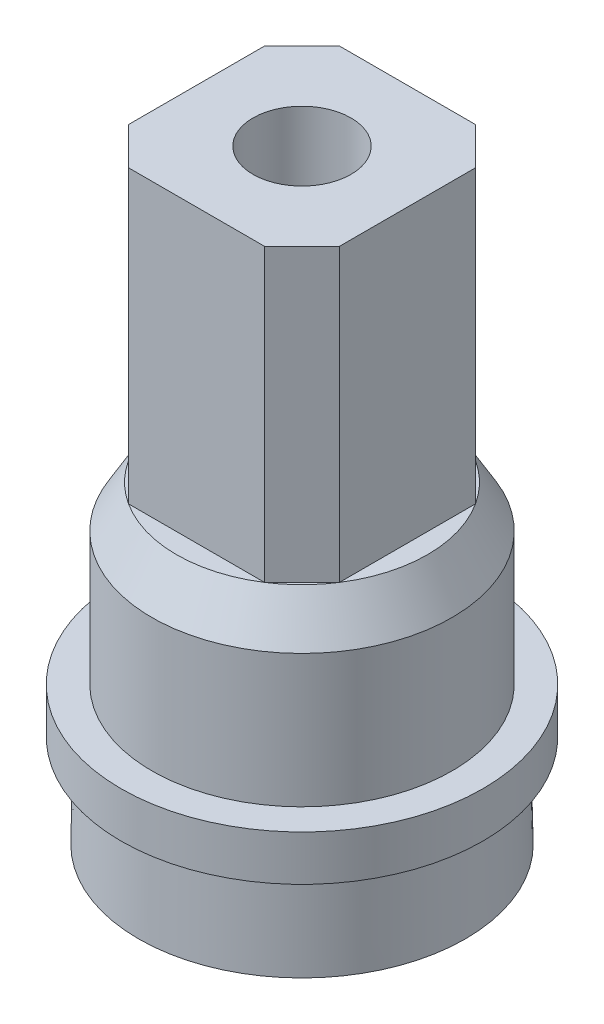
ISO-10303-21;
HEADER;
FILE_DESCRIPTION(('STEP AP214'),'2;1');
FILE_NAME('part.step','',(''),(''),'','','');
FILE_SCHEMA(('AUTOMOTIVE_DESIGN { 1 0 10303 214 1 1 1 1 }'));
ENDSEC;
DATA;
#1=APPLICATION_CONTEXT('core data for automotive mechanical design processes');
#2=APPLICATION_PROTOCOL_DEFINITION('international standard','automotive_design',2000,#1);
#3=PRODUCT_CONTEXT('',#1,'mechanical');
#4=PRODUCT('Part','Part','',(#3));
#5=PRODUCT_RELATED_PRODUCT_CATEGORY('part','',(#4));
#6=PRODUCT_DEFINITION_FORMATION('','',#4);
#7=PRODUCT_DEFINITION_CONTEXT('part definition',#1,'design');
#8=PRODUCT_DEFINITION('design','',#6,#7);
#9=PRODUCT_DEFINITION_SHAPE('','',#8);
#10=(LENGTH_UNIT() NAMED_UNIT(*) SI_UNIT(.MILLI.,.METRE.));
#11=(NAMED_UNIT(*) PLANE_ANGLE_UNIT() SI_UNIT($,.RADIAN.));
#12=(NAMED_UNIT(*) SI_UNIT($,.STERADIAN.) SOLID_ANGLE_UNIT());
#13=UNCERTAINTY_MEASURE_WITH_UNIT(LENGTH_MEASURE(1.E-05),#10,'distance_accuracy_value','');
#14=(GEOMETRIC_REPRESENTATION_CONTEXT(3) GLOBAL_UNCERTAINTY_ASSIGNED_CONTEXT((#13)) GLOBAL_UNIT_ASSIGNED_CONTEXT((#10,
#11,#12)) REPRESENTATION_CONTEXT('',''));
#15=CARTESIAN_POINT('',(0.,0.,0.));
#16=DIRECTION('',(0.,0.,1.));
#17=DIRECTION('',(1.,0.,0.));
#18=AXIS2_PLACEMENT_3D('',#15,#16,#17);
#19=CARTESIAN_POINT('',(-1.295,8.3,0.));
#20=DIRECTION('',(0.,-1.,0.));
#21=DIRECTION('',(0.,0.,-1.));
#22=AXIS2_PLACEMENT_3D('',#19,#20,#21);
#23=PLANE('',#22);
#24=DIRECTION('',(-0.707106781186548,0.,-0.707106781186548));
#25=VECTOR('',#24,1.);
#26=CARTESIAN_POINT('',(2.79,8.3,-1.79952771581879));
#27=LINE('',#26,#25);
#28=CARTESIAN_POINT('',(2.79,8.3,-1.79952771581879));
#29=VERTEX_POINT('',#28);
#30=CARTESIAN_POINT('',(1.79952771581879,8.3,-2.79));
#31=VERTEX_POINT('',#30);
#32=EDGE_CURVE('E149',#29,#31,#27,.T.);
#33=ORIENTED_EDGE('',*,*,#32,.F.);
#34=CARTESIAN_POINT('',(0.,8.3,0.));
#35=DIRECTION('',(0.,-1.,0.));
#36=DIRECTION('',(0.,0.,-1.));
#37=AXIS2_PLACEMENT_3D('',#34,#35,#36);
#38=CIRCLE('',#37,3.32);
#39=EDGE_CURVE('E183',#31,#29,#38,.T.);
#40=ORIENTED_EDGE('',*,*,#39,.F.);
#41=EDGE_LOOP('',(#33,#40));
#42=FACE_BOUND('',#41,.T.);
#43=ADVANCED_FACE('F40',(#42),#23,.F.);
#44=DIRECTION('',(0.,0.,-1.));
#45=VECTOR('',#44,1.);
#46=CARTESIAN_POINT('',(2.79,8.3,1.79952771581879));
#47=LINE('',#46,#45);
#48=CARTESIAN_POINT('',(2.79,8.3,1.79952771581879));
#49=VERTEX_POINT('',#48);
#50=EDGE_CURVE('E146',#49,#29,#47,.T.);
#51=ORIENTED_EDGE('',*,*,#50,.F.);
#52=EDGE_CURVE('E188',#29,#49,#38,.T.);
#53=ORIENTED_EDGE('',*,*,#52,.F.);
#54=EDGE_LOOP('',(#51,#53));
#55=FACE_BOUND('',#54,.T.);
#56=ADVANCED_FACE('F362',(#55),#23,.F.);
#57=DIRECTION('',(0.707106781186548,0.,-0.707106781186548));
#58=VECTOR('',#57,1.);
#59=CARTESIAN_POINT('',(1.79952771581879,8.3,2.79));
#60=LINE('',#59,#58);
#61=CARTESIAN_POINT('',(1.79952771581879,8.3,2.79));
#62=VERTEX_POINT('',#61);
#63=EDGE_CURVE('E260',#62,#49,#60,.T.);
#64=ORIENTED_EDGE('',*,*,#63,.F.);
#65=EDGE_CURVE('E318',#49,#62,#38,.T.);
#66=ORIENTED_EDGE('',*,*,#65,.F.);
#67=EDGE_LOOP('',(#64,#66));
#68=FACE_BOUND('',#67,.T.);
#69=ADVANCED_FACE('F317',(#68),#23,.F.);
#70=DIRECTION('',(1.,0.,0.));
#71=VECTOR('',#70,1.);
#72=CARTESIAN_POINT('',(-1.79952771581879,8.3,2.79));
#73=LINE('',#72,#71);
#74=CARTESIAN_POINT('',(-1.79952771581879,8.3,2.79));
#75=VERTEX_POINT('',#74);
#76=EDGE_CURVE('E308',#75,#62,#73,.T.);
#77=ORIENTED_EDGE('',*,*,#76,.F.);
#78=EDGE_CURVE('E321',#62,#75,#38,.T.);
#79=ORIENTED_EDGE('',*,*,#78,.F.);
#80=EDGE_LOOP('',(#77,#79));
#81=FACE_BOUND('',#80,.T.);
#82=ADVANCED_FACE('F322',(#81),#23,.F.);
#83=DIRECTION('',(0.707106781186548,0.,0.707106781186548));
#84=VECTOR('',#83,1.);
#85=CARTESIAN_POINT('',(-2.79,8.3,1.79952771581879));
#86=LINE('',#85,#84);
#87=CARTESIAN_POINT('',(-2.79,8.3,1.79952771581879));
#88=VERTEX_POINT('',#87);
#89=EDGE_CURVE('E66',#88,#75,#86,.T.);
#90=ORIENTED_EDGE('',*,*,#89,.F.);
#91=EDGE_CURVE('E325',#75,#88,#38,.T.);
#92=ORIENTED_EDGE('',*,*,#91,.F.);
#93=EDGE_LOOP('',(#90,#92));
#94=FACE_BOUND('',#93,.T.);
#95=ADVANCED_FACE('F381',(#94),#23,.F.);
#96=DIRECTION('',(0.,0.,1.));
#97=VECTOR('',#96,1.);
#98=CARTESIAN_POINT('',(-2.79,8.3,-1.79952771581879));
#99=LINE('',#98,#97);
#100=CARTESIAN_POINT('',(-2.79,8.3,-1.79952771581879));
#101=VERTEX_POINT('',#100);
#102=EDGE_CURVE('E58',#101,#88,#99,.T.);
#103=ORIENTED_EDGE('',*,*,#102,.F.);
#104=EDGE_CURVE('E377',#88,#101,#38,.T.);
#105=ORIENTED_EDGE('',*,*,#104,.F.);
#106=EDGE_LOOP('',(#103,#105));
#107=FACE_BOUND('',#106,.T.);
#108=ADVANCED_FACE('F374',(#107),#23,.F.);
#109=DIRECTION('',(-0.707106781186548,0.,0.707106781186548));
#110=VECTOR('',#109,1.);
#111=CARTESIAN_POINT('',(-1.79952771581879,8.3,-2.79));
#112=LINE('',#111,#110);
#113=CARTESIAN_POINT('',(-1.79952771581879,8.3,-2.79));
#114=VERTEX_POINT('',#113);
#115=EDGE_CURVE('E295',#114,#101,#112,.T.);
#116=ORIENTED_EDGE('',*,*,#115,.F.);
#117=EDGE_CURVE('E376',#101,#114,#38,.T.);
#118=ORIENTED_EDGE('',*,*,#117,.F.);
#119=EDGE_LOOP('',(#116,#118));
#120=FACE_BOUND('',#119,.T.);
#121=ADVANCED_FACE('F369',(#120),#23,.F.);
#122=DIRECTION('',(-1.,0.,0.));
#123=VECTOR('',#122,1.);
#124=CARTESIAN_POINT('',(1.79952771581879,8.3,-2.79));
#125=LINE('',#124,#123);
#126=EDGE_CURVE('E298',#31,#114,#125,.T.);
#127=ORIENTED_EDGE('',*,*,#126,.F.);
#128=EDGE_CURVE('E182',#114,#31,#38,.T.);
#129=ORIENTED_EDGE('',*,*,#128,.F.);
#130=EDGE_LOOP('',(#127,#129));
#131=FACE_BOUND('',#130,.T.);
#132=ADVANCED_FACE('F204',(#131),#23,.F.);
#133=CARTESIAN_POINT('',(-4.325,0.,0.));
#134=DIRECTION('',(0.,1.,0.));
#135=DIRECTION('',(0.,0.,1.));
#136=AXIS2_PLACEMENT_3D('',#133,#134,#135);
#137=PLANE('',#136);
#138=CARTESIAN_POINT('',(0.,0.,0.));
#139=DIRECTION('',(0.,-1.,0.));
#140=DIRECTION('',(0.,0.,-1.));
#141=AXIS2_PLACEMENT_3D('',#138,#139,#140);
#142=CIRCLE('',#141,2.7);
#143=CARTESIAN_POINT('',(0.,0.,-2.7));
#144=VERTEX_POINT('',#143);
#145=EDGE_CURVE('E11',#144,#144,#142,.T.);
#146=ORIENTED_EDGE('',*,*,#145,.F.);
#147=EDGE_LOOP('',(#146));
#148=FACE_BOUND('',#147,.T.);
#149=CARTESIAN_POINT('',(0.,0.,0.));
#150=DIRECTION('',(0.,-1.,0.));
#151=DIRECTION('',(0.,0.,-1.));
#152=AXIS2_PLACEMENT_3D('',#149,#150,#151);
#153=CIRCLE('',#152,4.325);
#154=CARTESIAN_POINT('',(0.,0.,-4.325));
#155=VERTEX_POINT('',#154);
#156=EDGE_CURVE('E151',#155,#155,#153,.T.);
#157=ORIENTED_EDGE('',*,*,#156,.T.);
#158=EDGE_LOOP('',(#157));
#159=FACE_BOUND('',#158,.T.);
#160=ADVANCED_FACE('F42',(#148,#159),#137,.F.);
#161=CARTESIAN_POINT('',(0.,0.,0.));
#162=DIRECTION('',(0.,-1.,0.));
#163=DIRECTION('',(0.,0.,-1.));
#164=AXIS2_PLACEMENT_3D('',#161,#162,#163);
#165=CYLINDRICAL_SURFACE('',#164,2.7);
#166=CARTESIAN_POINT('',(0.,5.54,0.));
#167=DIRECTION('',(0.,-1.,0.));
#168=DIRECTION('',(0.,0.,-1.));
#169=AXIS2_PLACEMENT_3D('',#166,#167,#168);
#170=CIRCLE('',#169,2.7);
#171=CARTESIAN_POINT('',(0.,5.54,-2.7));
#172=VERTEX_POINT('',#171);
#173=EDGE_CURVE('E49',#172,#172,#170,.T.);
#174=ORIENTED_EDGE('',*,*,#173,.F.);
#175=EDGE_LOOP('',(#174));
#176=FACE_BOUND('',#175,.T.);
#177=ORIENTED_EDGE('',*,*,#145,.T.);
#178=EDGE_LOOP('',(#177));
#179=FACE_BOUND('',#178,.T.);
#180=ADVANCED_FACE('F197',(#176,#179),#165,.F.);
#181=CARTESIAN_POINT('',(-2.7,5.54,0.));
#182=DIRECTION('',(0.,1.,0.));
#183=DIRECTION('',(0.,0.,1.));
#184=AXIS2_PLACEMENT_3D('',#181,#182,#183);
#185=PLANE('',#184);
#186=CARTESIAN_POINT('',(0.,5.54,0.));
#187=DIRECTION('',(0.,-1.,0.));
#188=DIRECTION('',(0.,0.,-1.));
#189=AXIS2_PLACEMENT_3D('',#186,#187,#188);
#190=CIRCLE('',#189,1.295);
#191=CARTESIAN_POINT('',(0.,5.54,-1.295));
#192=VERTEX_POINT('',#191);
#193=EDGE_CURVE('E187',#192,#192,#190,.T.);
#194=ORIENTED_EDGE('',*,*,#193,.F.);
#195=EDGE_LOOP('',(#194));
#196=FACE_BOUND('',#195,.T.);
#197=ORIENTED_EDGE('',*,*,#173,.T.);
#198=EDGE_LOOP('',(#197));
#199=FACE_BOUND('',#198,.T.);
#200=ADVANCED_FACE('F195',(#196,#199),#185,.F.);
#201=CARTESIAN_POINT('',(0.,0.,0.));
#202=DIRECTION('',(0.,-1.,0.));
#203=DIRECTION('',(0.,0.,-1.));
#204=AXIS2_PLACEMENT_3D('',#201,#202,#203);
#205=CYLINDRICAL_SURFACE('',#204,1.295);
#206=ORIENTED_EDGE('',*,*,#193,.T.);
#207=EDGE_LOOP('',(#206));
#208=FACE_BOUND('',#207,.T.);
#209=CARTESIAN_POINT('',(0.,16.,0.));
#210=DIRECTION('',(0.,1.,0.));
#211=DIRECTION('',(0.,0.,1.));
#212=AXIS2_PLACEMENT_3D('',#209,#210,#211);
#213=CIRCLE('',#212,1.295);
#214=CARTESIAN_POINT('',(0.,16.,1.295));
#215=VERTEX_POINT('',#214);
#216=EDGE_CURVE('E346',#215,#215,#213,.T.);
#217=ORIENTED_EDGE('',*,*,#216,.T.);
#218=EDGE_LOOP('',(#217));
#219=FACE_BOUND('',#218,.T.);
#220=ADVANCED_FACE('F240',(#208,#219),#205,.F.);
#221=CARTESIAN_POINT('',(0.,8.3,0.));
#222=DIRECTION('',(0.,-1.,0.));
#223=DIRECTION('',(0.,0.,-1.));
#224=AXIS2_PLACEMENT_3D('',#221,#222,#223);
#225=CONICAL_SURFACE('',#224,3.32,0.527554966909787);
#226=CARTESIAN_POINT('',(0.,7.18438312144079,0.));
#227=DIRECTION('',(0.,-1.,0.));
#228=DIRECTION('',(0.,0.,-1.));
#229=AXIS2_PLACEMENT_3D('',#226,#227,#228);
#230=CIRCLE('',#229,3.97);
#231=CARTESIAN_POINT('',(0.,7.18438312144079,-3.97));
#232=VERTEX_POINT('',#231);
#233=EDGE_CURVE('E178',#232,#232,#230,.T.);
#234=ORIENTED_EDGE('',*,*,#233,.F.);
#235=EDGE_LOOP('',(#234));
#236=FACE_BOUND('',#235,.T.);
#237=ORIENTED_EDGE('',*,*,#39,.T.);
#238=ORIENTED_EDGE('',*,*,#52,.T.);
#239=ORIENTED_EDGE('',*,*,#65,.T.);
#240=ORIENTED_EDGE('',*,*,#78,.T.);
#241=ORIENTED_EDGE('',*,*,#91,.T.);
#242=ORIENTED_EDGE('',*,*,#104,.T.);
#243=ORIENTED_EDGE('',*,*,#117,.T.);
#244=ORIENTED_EDGE('',*,*,#128,.T.);
#245=EDGE_LOOP('',(#237,#238,#239,#240,#241,#242,#243,#244));
#246=FACE_BOUND('',#245,.T.);
#247=ADVANCED_FACE('F234',(#236,#246),#225,.T.);
#248=CARTESIAN_POINT('',(0.,0.,0.));
#249=DIRECTION('',(0.,-1.,0.));
#250=DIRECTION('',(0.,0.,-1.));
#251=AXIS2_PLACEMENT_3D('',#248,#249,#250);
#252=CYLINDRICAL_SURFACE('',#251,3.97);
#253=CARTESIAN_POINT('',(0.,3.67,0.));
#254=DIRECTION('',(0.,-1.,0.));
#255=DIRECTION('',(0.,0.,-1.));
#256=AXIS2_PLACEMENT_3D('',#253,#254,#255);
#257=CIRCLE('',#256,3.97);
#258=CARTESIAN_POINT('',(0.,3.67,-3.97));
#259=VERTEX_POINT('',#258);
#260=EDGE_CURVE('E174',#259,#259,#257,.T.);
#261=ORIENTED_EDGE('',*,*,#260,.F.);
#262=EDGE_LOOP('',(#261));
#263=FACE_BOUND('',#262,.T.);
#264=ORIENTED_EDGE('',*,*,#233,.T.);
#265=EDGE_LOOP('',(#264));
#266=FACE_BOUND('',#265,.T.);
#267=ADVANCED_FACE('F228',(#263,#266),#252,.T.);
#268=CARTESIAN_POINT('',(-3.97,3.67,0.));
#269=DIRECTION('',(0.,-1.,0.));
#270=DIRECTION('',(0.,0.,-1.));
#271=AXIS2_PLACEMENT_3D('',#268,#269,#270);
#272=PLANE('',#271);
#273=CARTESIAN_POINT('',(0.,3.67,0.));
#274=DIRECTION('',(0.,-1.,0.));
#275=DIRECTION('',(0.,0.,-1.));
#276=AXIS2_PLACEMENT_3D('',#273,#274,#275);
#277=CIRCLE('',#276,4.785);
#278=CARTESIAN_POINT('',(0.,3.67,-4.785));
#279=VERTEX_POINT('',#278);
#280=EDGE_CURVE('E170',#279,#279,#277,.T.);
#281=ORIENTED_EDGE('',*,*,#280,.F.);
#282=EDGE_LOOP('',(#281));
#283=FACE_BOUND('',#282,.T.);
#284=ORIENTED_EDGE('',*,*,#260,.T.);
#285=EDGE_LOOP('',(#284));
#286=FACE_BOUND('',#285,.T.);
#287=ADVANCED_FACE('F222',(#283,#286),#272,.F.);
#288=CARTESIAN_POINT('',(0.,0.,0.));
#289=DIRECTION('',(0.,-1.,0.));
#290=DIRECTION('',(0.,0.,-1.));
#291=AXIS2_PLACEMENT_3D('',#288,#289,#290);
#292=CYLINDRICAL_SURFACE('',#291,4.785);
#293=CARTESIAN_POINT('',(0.,2.47,0.));
#294=DIRECTION('',(0.,-1.,0.));
#295=DIRECTION('',(0.,0.,-1.));
#296=AXIS2_PLACEMENT_3D('',#293,#294,#295);
#297=CIRCLE('',#296,4.785);
#298=CARTESIAN_POINT('',(0.,2.47,-4.785));
#299=VERTEX_POINT('',#298);
#300=EDGE_CURVE('E166',#299,#299,#297,.T.);
#301=ORIENTED_EDGE('',*,*,#300,.F.);
#302=EDGE_LOOP('',(#301));
#303=FACE_BOUND('',#302,.T.);
#304=ORIENTED_EDGE('',*,*,#280,.T.);
#305=EDGE_LOOP('',(#304));
#306=FACE_BOUND('',#305,.T.);
#307=ADVANCED_FACE('F216',(#303,#306),#292,.T.);
#308=CARTESIAN_POINT('',(-4.785,2.47,0.));
#309=DIRECTION('',(0.,1.,0.));
#310=DIRECTION('',(0.,0.,1.));
#311=AXIS2_PLACEMENT_3D('',#308,#309,#310);
#312=PLANE('',#311);
#313=CARTESIAN_POINT('',(0.,2.47,0.));
#314=DIRECTION('',(0.,-1.,0.));
#315=DIRECTION('',(0.,0.,-1.));
#316=AXIS2_PLACEMENT_3D('',#313,#314,#315);
#317=CIRCLE('',#316,4.28);
#318=CARTESIAN_POINT('',(0.,2.47,-4.28));
#319=VERTEX_POINT('',#318);
#320=EDGE_CURVE('E156',#319,#319,#317,.T.);
#321=ORIENTED_EDGE('',*,*,#320,.F.);
#322=EDGE_LOOP('',(#321));
#323=FACE_BOUND('',#322,.T.);
#324=ORIENTED_EDGE('',*,*,#300,.T.);
#325=EDGE_LOOP('',(#324));
#326=FACE_BOUND('',#325,.T.);
#327=ADVANCED_FACE('F210',(#323,#326),#312,.F.);
#328=CARTESIAN_POINT('',(0.,2.47,0.));
#329=DIRECTION('',(0.,-1.,0.));
#330=DIRECTION('',(0.,0.,-1.));
#331=AXIS2_PLACEMENT_3D('',#328,#329,#330);
#332=CONICAL_SURFACE('',#331,4.28,0.018216608185291);
#333=ORIENTED_EDGE('',*,*,#156,.F.);
#334=EDGE_LOOP('',(#333));
#335=FACE_BOUND('',#334,.T.);
#336=ORIENTED_EDGE('',*,*,#320,.T.);
#337=EDGE_LOOP('',(#336));
#338=FACE_BOUND('',#337,.T.);
#339=ADVANCED_FACE('F207',(#335,#338),#332,.T.);
#340=CARTESIAN_POINT('',(0.,16.,0.));
#341=DIRECTION('',(0.,1.,0.));
#342=DIRECTION('',(0.,0.,1.));
#343=AXIS2_PLACEMENT_3D('',#340,#341,#342);
#344=PLANE('',#343);
#345=DIRECTION('',(-0.707106781186548,0.,-0.707106781186548));
#346=VECTOR('',#345,1.);
#347=CARTESIAN_POINT('',(2.79,16.,-1.79952771581879));
#348=LINE('',#347,#346);
#349=CARTESIAN_POINT('',(2.79,16.,-1.79952771581879));
#350=VERTEX_POINT('',#349);
#351=CARTESIAN_POINT('',(1.79952771581879,16.,-2.79));
#352=VERTEX_POINT('',#351);
#353=EDGE_CURVE('E135',#350,#352,#348,.T.);
#354=ORIENTED_EDGE('',*,*,#353,.T.);
#355=DIRECTION('',(-1.,0.,0.));
#356=VECTOR('',#355,1.);
#357=CARTESIAN_POINT('',(1.79952771581879,16.,-2.79));
#358=LINE('',#357,#356);
#359=CARTESIAN_POINT('',(-1.79952771581879,16.,-2.79));
#360=VERTEX_POINT('',#359);
#361=EDGE_CURVE('E122',#352,#360,#358,.T.);
#362=ORIENTED_EDGE('',*,*,#361,.T.);
#363=DIRECTION('',(-0.707106781186548,0.,0.707106781186548));
#364=VECTOR('',#363,1.);
#365=CARTESIAN_POINT('',(-1.79952771581879,16.,-2.79));
#366=LINE('',#365,#364);
#367=CARTESIAN_POINT('',(-2.79,16.,-1.79952771581879));
#368=VERTEX_POINT('',#367);
#369=EDGE_CURVE('E134',#360,#368,#366,.T.);
#370=ORIENTED_EDGE('',*,*,#369,.T.);
#371=DIRECTION('',(0.,0.,1.));
#372=VECTOR('',#371,1.);
#373=CARTESIAN_POINT('',(-2.79,16.,-1.79952771581879));
#374=LINE('',#373,#372);
#375=CARTESIAN_POINT('',(-2.79,16.,1.79952771581879));
#376=VERTEX_POINT('',#375);
#377=EDGE_CURVE('E290',#368,#376,#374,.T.);
#378=ORIENTED_EDGE('',*,*,#377,.T.);
#379=DIRECTION('',(0.707106781186548,0.,0.707106781186548));
#380=VECTOR('',#379,1.);
#381=CARTESIAN_POINT('',(-2.79,16.,1.79952771581879));
#382=LINE('',#381,#380);
#383=CARTESIAN_POINT('',(-1.79952771581879,16.,2.79));
#384=VERTEX_POINT('',#383);
#385=EDGE_CURVE('E335',#376,#384,#382,.T.);
#386=ORIENTED_EDGE('',*,*,#385,.T.);
#387=DIRECTION('',(1.,0.,0.));
#388=VECTOR('',#387,1.);
#389=CARTESIAN_POINT('',(-1.79952771581879,16.,2.79));
#390=LINE('',#389,#388);
#391=CARTESIAN_POINT('',(1.79952771581879,16.,2.79));
#392=VERTEX_POINT('',#391);
#393=EDGE_CURVE('E331',#384,#392,#390,.T.);
#394=ORIENTED_EDGE('',*,*,#393,.T.);
#395=DIRECTION('',(0.707106781186548,0.,-0.707106781186548));
#396=VECTOR('',#395,1.);
#397=CARTESIAN_POINT('',(1.79952771581879,16.,2.79));
#398=LINE('',#397,#396);
#399=CARTESIAN_POINT('',(2.79,16.,1.79952771581879));
#400=VERTEX_POINT('',#399);
#401=EDGE_CURVE('E267',#392,#400,#398,.T.);
#402=ORIENTED_EDGE('',*,*,#401,.T.);
#403=DIRECTION('',(0.,0.,-1.));
#404=VECTOR('',#403,1.);
#405=CARTESIAN_POINT('',(2.79,16.,1.79952771581879));
#406=LINE('',#405,#404);
#407=EDGE_CURVE('E141',#400,#350,#406,.T.);
#408=ORIENTED_EDGE('',*,*,#407,.T.);
#409=EDGE_LOOP('',(#354,#362,#370,#378,#386,#394,#402,#408));
#410=FACE_BOUND('',#409,.T.);
#411=ORIENTED_EDGE('',*,*,#216,.F.);
#412=EDGE_LOOP('',(#411));
#413=FACE_BOUND('',#412,.T.);
#414=ADVANCED_FACE('F138',(#410,#413),#344,.T.);
#415=CARTESIAN_POINT('',(2.79,16.,-1.79952771581879));
#416=DIRECTION('',(-0.707106781186548,0.,0.707106781186548));
#417=DIRECTION('',(0.707106781186548,0.,0.707106781186548));
#418=AXIS2_PLACEMENT_3D('',#415,#416,#417);
#419=PLANE('',#418);
#420=ORIENTED_EDGE('',*,*,#32,.T.);
#421=DIRECTION('',(0.,-1.,0.));
#422=VECTOR('',#421,1.);
#423=CARTESIAN_POINT('',(1.79952771581879,16.,-2.79));
#424=LINE('',#423,#422);
#425=EDGE_CURVE('E127',#352,#31,#424,.T.);
#426=ORIENTED_EDGE('',*,*,#425,.F.);
#427=ORIENTED_EDGE('',*,*,#353,.F.);
#428=DIRECTION('',(0.,-1.,0.));
#429=VECTOR('',#428,1.);
#430=CARTESIAN_POINT('',(2.79,16.,-1.79952771581879));
#431=LINE('',#430,#429);
#432=EDGE_CURVE('E254',#350,#29,#431,.T.);
#433=ORIENTED_EDGE('',*,*,#432,.T.);
#434=EDGE_LOOP('',(#420,#426,#427,#433));
#435=FACE_BOUND('',#434,.T.);
#436=ADVANCED_FACE('F148',(#435),#419,.F.);
#437=CARTESIAN_POINT('',(1.79952771581879,16.,-2.79));
#438=DIRECTION('',(0.,0.,1.));
#439=DIRECTION('',(1.,0.,0.));
#440=AXIS2_PLACEMENT_3D('',#437,#438,#439);
#441=PLANE('',#440);
#442=ORIENTED_EDGE('',*,*,#126,.T.);
#443=DIRECTION('',(0.,-1.,0.));
#444=VECTOR('',#443,1.);
#445=CARTESIAN_POINT('',(-1.79952771581879,16.,-2.79));
#446=LINE('',#445,#444);
#447=EDGE_CURVE('E130',#360,#114,#446,.T.);
#448=ORIENTED_EDGE('',*,*,#447,.F.);
#449=ORIENTED_EDGE('',*,*,#361,.F.);
#450=ORIENTED_EDGE('',*,*,#425,.T.);
#451=EDGE_LOOP('',(#442,#448,#449,#450));
#452=FACE_BOUND('',#451,.T.);
#453=ADVANCED_FACE('F125',(#452),#441,.F.);
#454=CARTESIAN_POINT('',(-1.79952771581879,16.,-2.79));
#455=DIRECTION('',(0.707106781186548,0.,0.707106781186548));
#456=DIRECTION('',(0.707106781186548,0.,-0.707106781186548));
#457=AXIS2_PLACEMENT_3D('',#454,#455,#456);
#458=PLANE('',#457);
#459=ORIENTED_EDGE('',*,*,#115,.T.);
#460=DIRECTION('',(0.,-1.,0.));
#461=VECTOR('',#460,1.);
#462=CARTESIAN_POINT('',(-2.79,16.,-1.79952771581879));
#463=LINE('',#462,#461);
#464=EDGE_CURVE('E159',#368,#101,#463,.T.);
#465=ORIENTED_EDGE('',*,*,#464,.F.);
#466=ORIENTED_EDGE('',*,*,#369,.F.);
#467=ORIENTED_EDGE('',*,*,#447,.T.);
#468=EDGE_LOOP('',(#459,#465,#466,#467));
#469=FACE_BOUND('',#468,.T.);
#470=ADVANCED_FACE('F293',(#469),#458,.F.);
#471=CARTESIAN_POINT('',(-2.79,16.,-1.79952771581879));
#472=DIRECTION('',(1.,0.,0.));
#473=DIRECTION('',(0.,0.,-1.));
#474=AXIS2_PLACEMENT_3D('',#471,#472,#473);
#475=PLANE('',#474);
#476=ORIENTED_EDGE('',*,*,#102,.T.);
#477=DIRECTION('',(0.,-1.,0.));
#478=VECTOR('',#477,1.);
#479=CARTESIAN_POINT('',(-2.79,16.,1.79952771581879));
#480=LINE('',#479,#478);
#481=EDGE_CURVE('E278',#376,#88,#480,.T.);
#482=ORIENTED_EDGE('',*,*,#481,.F.);
#483=ORIENTED_EDGE('',*,*,#377,.F.);
#484=ORIENTED_EDGE('',*,*,#464,.T.);
#485=EDGE_LOOP('',(#476,#482,#483,#484));
#486=FACE_BOUND('',#485,.T.);
#487=ADVANCED_FACE('F288',(#486),#475,.F.);
#488=CARTESIAN_POINT('',(-2.79,16.,1.79952771581879));
#489=DIRECTION('',(0.707106781186548,0.,-0.707106781186548));
#490=DIRECTION('',(-0.707106781186548,0.,-0.707106781186548));
#491=AXIS2_PLACEMENT_3D('',#488,#489,#490);
#492=PLANE('',#491);
#493=ORIENTED_EDGE('',*,*,#89,.T.);
#494=DIRECTION('',(0.,-1.,0.));
#495=VECTOR('',#494,1.);
#496=CARTESIAN_POINT('',(-1.79952771581879,16.,2.79));
#497=LINE('',#496,#495);
#498=EDGE_CURVE('E274',#384,#75,#497,.T.);
#499=ORIENTED_EDGE('',*,*,#498,.F.);
#500=ORIENTED_EDGE('',*,*,#385,.F.);
#501=ORIENTED_EDGE('',*,*,#481,.T.);
#502=EDGE_LOOP('',(#493,#499,#500,#501));
#503=FACE_BOUND('',#502,.T.);
#504=ADVANCED_FACE('F334',(#503),#492,.F.);
#505=CARTESIAN_POINT('',(-1.79952771581879,16.,2.79));
#506=DIRECTION('',(0.,0.,-1.));
#507=DIRECTION('',(-1.,0.,0.));
#508=AXIS2_PLACEMENT_3D('',#505,#506,#507);
#509=PLANE('',#508);
#510=ORIENTED_EDGE('',*,*,#76,.T.);
#511=DIRECTION('',(0.,-1.,0.));
#512=VECTOR('',#511,1.);
#513=CARTESIAN_POINT('',(1.79952771581879,16.,2.79));
#514=LINE('',#513,#512);
#515=EDGE_CURVE('E265',#392,#62,#514,.T.);
#516=ORIENTED_EDGE('',*,*,#515,.F.);
#517=ORIENTED_EDGE('',*,*,#393,.F.);
#518=ORIENTED_EDGE('',*,*,#498,.T.);
#519=EDGE_LOOP('',(#510,#516,#517,#518));
#520=FACE_BOUND('',#519,.T.);
#521=ADVANCED_FACE('F328',(#520),#509,.F.);
#522=CARTESIAN_POINT('',(1.79952771581879,16.,2.79));
#523=DIRECTION('',(-0.707106781186548,0.,-0.707106781186548));
#524=DIRECTION('',(-0.707106781186548,0.,0.707106781186548));
#525=AXIS2_PLACEMENT_3D('',#522,#523,#524);
#526=PLANE('',#525);
#527=ORIENTED_EDGE('',*,*,#63,.T.);
#528=DIRECTION('',(0.,-1.,0.));
#529=VECTOR('',#528,1.);
#530=CARTESIAN_POINT('',(2.79,16.,1.79952771581879));
#531=LINE('',#530,#529);
#532=EDGE_CURVE('E256',#400,#49,#531,.T.);
#533=ORIENTED_EDGE('',*,*,#532,.F.);
#534=ORIENTED_EDGE('',*,*,#401,.F.);
#535=ORIENTED_EDGE('',*,*,#515,.T.);
#536=EDGE_LOOP('',(#527,#533,#534,#535));
#537=FACE_BOUND('',#536,.T.);
#538=ADVANCED_FACE('F312',(#537),#526,.F.);
#539=CARTESIAN_POINT('',(2.79,16.,1.79952771581879));
#540=DIRECTION('',(-1.,0.,0.));
#541=DIRECTION('',(0.,0.,1.));
#542=AXIS2_PLACEMENT_3D('',#539,#540,#541);
#543=PLANE('',#542);
#544=ORIENTED_EDGE('',*,*,#50,.T.);
#545=ORIENTED_EDGE('',*,*,#432,.F.);
#546=ORIENTED_EDGE('',*,*,#407,.F.);
#547=ORIENTED_EDGE('',*,*,#532,.T.);
#548=EDGE_LOOP('',(#544,#545,#546,#547));
#549=FACE_BOUND('',#548,.T.);
#550=ADVANCED_FACE('F253',(#549),#543,.F.);
#551=CLOSED_SHELL('',(#43,#56,#69,#82,#95,#108,#121,#132,#160,#180,#200,#220,#247,#267,#287,
#307,#327,#339,#414,#436,#453,#470,#487,#504,#521,#538,#550));
#552=MANIFOLD_SOLID_BREP('B2',#551);
#553=ADVANCED_BREP_SHAPE_REPRESENTATION('',(#18,#552),#14);
#554=SHAPE_DEFINITION_REPRESENTATION(#9,#553);
ENDSEC;
END-ISO-10303-21;
